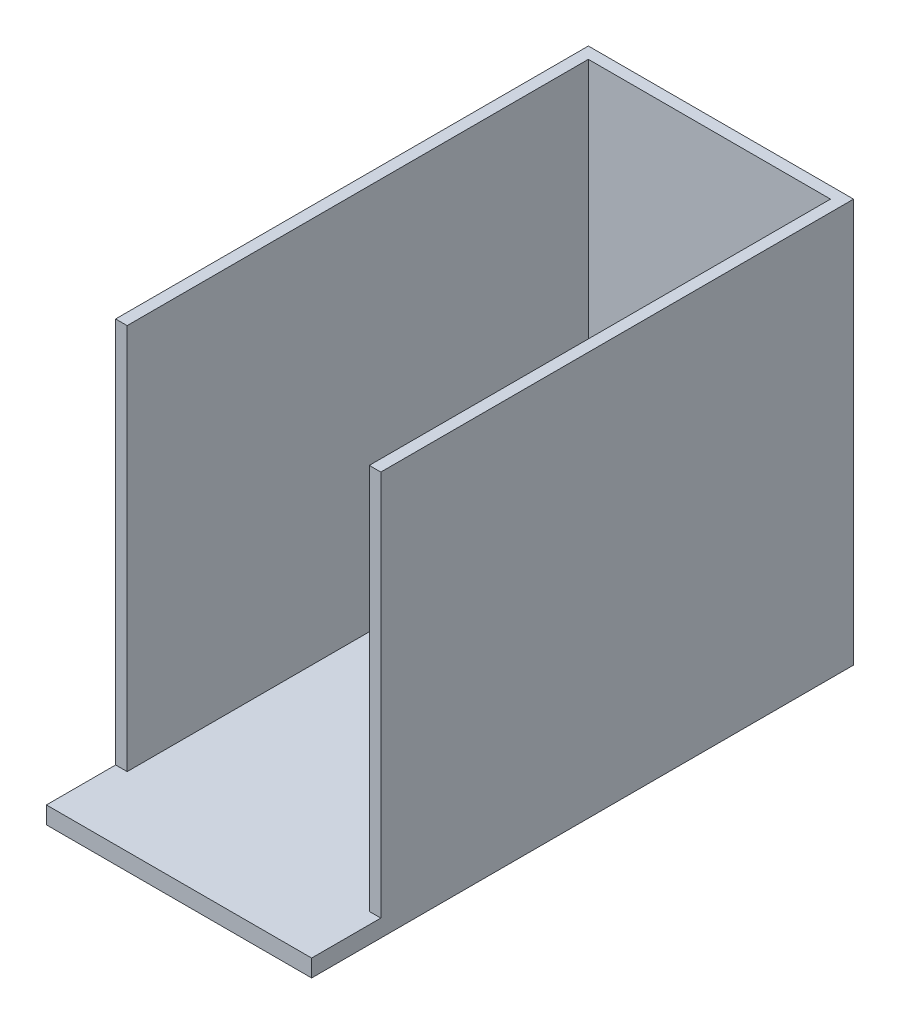
ISO-10303-21;
HEADER;
FILE_DESCRIPTION(('STEP AP214'),'2;1');
FILE_NAME('part.step','',(''),(''),'','','');
FILE_SCHEMA(('AUTOMOTIVE_DESIGN { 1 0 10303 214 1 1 1 1 }'));
ENDSEC;
DATA;
#1=APPLICATION_CONTEXT('core data for automotive mechanical design processes');
#2=APPLICATION_PROTOCOL_DEFINITION('international standard','automotive_design',2000,#1);
#3=PRODUCT_CONTEXT('',#1,'mechanical');
#4=PRODUCT('Part','Part','',(#3));
#5=PRODUCT_RELATED_PRODUCT_CATEGORY('part','',(#4));
#6=PRODUCT_DEFINITION_FORMATION('','',#4);
#7=PRODUCT_DEFINITION_CONTEXT('part definition',#1,'design');
#8=PRODUCT_DEFINITION('design','',#6,#7);
#9=PRODUCT_DEFINITION_SHAPE('','',#8);
#10=(LENGTH_UNIT() NAMED_UNIT(*) SI_UNIT(.MILLI.,.METRE.));
#11=(NAMED_UNIT(*) PLANE_ANGLE_UNIT() SI_UNIT($,.RADIAN.));
#12=(NAMED_UNIT(*) SI_UNIT($,.STERADIAN.) SOLID_ANGLE_UNIT());
#13=UNCERTAINTY_MEASURE_WITH_UNIT(LENGTH_MEASURE(1.E-05),#10,'distance_accuracy_value','');
#14=(GEOMETRIC_REPRESENTATION_CONTEXT(3) GLOBAL_UNCERTAINTY_ASSIGNED_CONTEXT((#13)) GLOBAL_UNIT_ASSIGNED_CONTEXT((#10,
#11,#12)) REPRESENTATION_CONTEXT('',''));
#15=CARTESIAN_POINT('',(0.,0.,0.));
#16=DIRECTION('',(0.,0.,1.));
#17=DIRECTION('',(1.,0.,0.));
#18=AXIS2_PLACEMENT_3D('',#15,#16,#17);
#19=CARTESIAN_POINT('',(0.,19.05,0.));
#20=DIRECTION('',(0.,-1.,0.));
#21=DIRECTION('',(0.,0.,-1.));
#22=AXIS2_PLACEMENT_3D('',#19,#20,#21);
#23=PLANE('',#22);
#24=DIRECTION('',(1.,0.,0.));
#25=VECTOR('',#24,1.);
#26=CARTESIAN_POINT('',(-133.35,19.05,222.25));
#27=LINE('',#26,#25);
#28=CARTESIAN_POINT('',(-146.05,19.05,222.25));
#29=VERTEX_POINT('',#28);
#30=CARTESIAN_POINT('',(-133.35,19.05,222.25));
#31=VERTEX_POINT('',#30);
#32=EDGE_CURVE('E132',#29,#31,#27,.T.);
#33=ORIENTED_EDGE('',*,*,#32,.F.);
#34=DIRECTION('',(0.,0.,1.));
#35=VECTOR('',#34,1.);
#36=CARTESIAN_POINT('',(-146.05,19.05,298.45));
#37=LINE('',#36,#35);
#38=CARTESIAN_POINT('',(-146.05,19.05,298.45));
#39=VERTEX_POINT('',#38);
#40=EDGE_CURVE('E144',#29,#39,#37,.T.);
#41=ORIENTED_EDGE('',*,*,#40,.T.);
#42=DIRECTION('',(1.,0.,0.));
#43=VECTOR('',#42,1.);
#44=CARTESIAN_POINT('',(-146.05,19.05,298.45));
#45=LINE('',#44,#43);
#46=CARTESIAN_POINT('',(146.05,19.05,298.45));
#47=VERTEX_POINT('',#46);
#48=EDGE_CURVE('E147',#39,#47,#45,.T.);
#49=ORIENTED_EDGE('',*,*,#48,.T.);
#50=DIRECTION('',(0.,0.,-1.));
#51=VECTOR('',#50,1.);
#52=CARTESIAN_POINT('',(146.05,19.05,298.45));
#53=LINE('',#52,#51);
#54=CARTESIAN_POINT('',(146.05,19.05,222.25));
#55=VERTEX_POINT('',#54);
#56=EDGE_CURVE('E142',#47,#55,#53,.T.);
#57=ORIENTED_EDGE('',*,*,#56,.T.);
#58=DIRECTION('',(1.,0.,0.));
#59=VECTOR('',#58,1.);
#60=CARTESIAN_POINT('',(146.05,19.05,222.25));
#61=LINE('',#60,#59);
#62=CARTESIAN_POINT('',(133.35,19.05,222.25));
#63=VERTEX_POINT('',#62);
#64=EDGE_CURVE('E48',#63,#55,#61,.T.);
#65=ORIENTED_EDGE('',*,*,#64,.F.);
#66=DIRECTION('',(0.,0.,1.));
#67=VECTOR('',#66,1.);
#68=CARTESIAN_POINT('',(133.35,19.05,222.25));
#69=LINE('',#68,#67);
#70=CARTESIAN_POINT('',(133.35,19.05,-285.75));
#71=VERTEX_POINT('',#70);
#72=EDGE_CURVE('E52',#71,#63,#69,.T.);
#73=ORIENTED_EDGE('',*,*,#72,.F.);
#74=DIRECTION('',(1.,0.,0.));
#75=VECTOR('',#74,1.);
#76=CARTESIAN_POINT('',(133.35,19.05,-285.75));
#77=LINE('',#76,#75);
#78=CARTESIAN_POINT('',(-133.35,19.05,-285.75));
#79=VERTEX_POINT('',#78);
#80=EDGE_CURVE('E186',#79,#71,#77,.T.);
#81=ORIENTED_EDGE('',*,*,#80,.F.);
#82=DIRECTION('',(0.,0.,-1.));
#83=VECTOR('',#82,1.);
#84=CARTESIAN_POINT('',(-133.35,19.05,-285.75));
#85=LINE('',#84,#83);
#86=EDGE_CURVE('E201',#31,#79,#85,.T.);
#87=ORIENTED_EDGE('',*,*,#86,.F.);
#88=EDGE_LOOP('',(#33,#41,#49,#57,#65,#73,#81,#87));
#89=FACE_BOUND('',#88,.T.);
#90=ADVANCED_FACE('F33',(#89),#23,.F.);
#91=CARTESIAN_POINT('',(146.05,19.05,298.45));
#92=DIRECTION('',(-1.,0.,0.));
#93=DIRECTION('',(0.,0.,1.));
#94=AXIS2_PLACEMENT_3D('',#91,#92,#93);
#95=PLANE('',#94);
#96=DIRECTION('',(0.,0.,-1.));
#97=VECTOR('',#96,1.);
#98=CARTESIAN_POINT('',(146.05,0.,298.45));
#99=LINE('',#98,#97);
#100=CARTESIAN_POINT('',(146.05,0.,298.45));
#101=VERTEX_POINT('',#100);
#102=CARTESIAN_POINT('',(146.05,0.,-298.45));
#103=VERTEX_POINT('',#102);
#104=EDGE_CURVE('E133',#101,#103,#99,.T.);
#105=ORIENTED_EDGE('',*,*,#104,.T.);
#106=DIRECTION('',(0.,-1.,0.));
#107=VECTOR('',#106,1.);
#108=CARTESIAN_POINT('',(146.05,19.05,-298.45));
#109=LINE('',#108,#107);
#110=CARTESIAN_POINT('',(146.05,444.5,-298.45));
#111=VERTEX_POINT('',#110);
#112=EDGE_CURVE('E11',#111,#103,#109,.T.);
#113=ORIENTED_EDGE('',*,*,#112,.F.);
#114=DIRECTION('',(0.,0.,-1.));
#115=VECTOR('',#114,1.);
#116=CARTESIAN_POINT('',(146.05,444.5,-298.45));
#117=LINE('',#116,#115);
#118=CARTESIAN_POINT('',(146.05,444.5,222.25));
#119=VERTEX_POINT('',#118);
#120=EDGE_CURVE('E208',#119,#111,#117,.T.);
#121=ORIENTED_EDGE('',*,*,#120,.F.);
#122=DIRECTION('',(0.,-1.,0.));
#123=VECTOR('',#122,1.);
#124=CARTESIAN_POINT('',(146.05,444.5,222.25));
#125=LINE('',#124,#123);
#126=EDGE_CURVE('E178',#119,#55,#125,.T.);
#127=ORIENTED_EDGE('',*,*,#126,.T.);
#128=ORIENTED_EDGE('',*,*,#56,.F.);
#129=DIRECTION('',(0.,-1.,0.));
#130=VECTOR('',#129,1.);
#131=CARTESIAN_POINT('',(146.05,19.05,298.45));
#132=LINE('',#131,#130);
#133=EDGE_CURVE('E148',#47,#101,#132,.T.);
#134=ORIENTED_EDGE('',*,*,#133,.T.);
#135=EDGE_LOOP('',(#105,#113,#121,#127,#128,#134));
#136=FACE_BOUND('',#135,.T.);
#137=ADVANCED_FACE('F35',(#136),#95,.F.);
#138=CARTESIAN_POINT('',(-146.05,19.05,-298.45));
#139=DIRECTION('',(0.,0.,1.));
#140=DIRECTION('',(1.,0.,0.));
#141=AXIS2_PLACEMENT_3D('',#138,#139,#140);
#142=PLANE('',#141);
#143=DIRECTION('',(-1.,0.,0.));
#144=VECTOR('',#143,1.);
#145=CARTESIAN_POINT('',(-146.05,0.,-298.45));
#146=LINE('',#145,#144);
#147=CARTESIAN_POINT('',(-146.05,0.,-298.45));
#148=VERTEX_POINT('',#147);
#149=EDGE_CURVE('E136',#103,#148,#146,.T.);
#150=ORIENTED_EDGE('',*,*,#149,.T.);
#151=DIRECTION('',(0.,-1.,0.));
#152=VECTOR('',#151,1.);
#153=CARTESIAN_POINT('',(-146.05,19.05,-298.45));
#154=LINE('',#153,#152);
#155=CARTESIAN_POINT('',(-146.05,444.5,-298.45));
#156=VERTEX_POINT('',#155);
#157=EDGE_CURVE('E41',#156,#148,#154,.T.);
#158=ORIENTED_EDGE('',*,*,#157,.F.);
#159=DIRECTION('',(-1.,0.,0.));
#160=VECTOR('',#159,1.);
#161=CARTESIAN_POINT('',(-146.05,444.5,-298.45));
#162=LINE('',#161,#160);
#163=EDGE_CURVE('E206',#111,#156,#162,.T.);
#164=ORIENTED_EDGE('',*,*,#163,.F.);
#165=ORIENTED_EDGE('',*,*,#112,.T.);
#166=EDGE_LOOP('',(#150,#158,#164,#165));
#167=FACE_BOUND('',#166,.T.);
#168=ADVANCED_FACE('F214',(#167),#142,.F.);
#169=CARTESIAN_POINT('',(-146.05,19.05,298.45));
#170=DIRECTION('',(1.,0.,0.));
#171=DIRECTION('',(0.,0.,-1.));
#172=AXIS2_PLACEMENT_3D('',#169,#170,#171);
#173=PLANE('',#172);
#174=DIRECTION('',(0.,0.,1.));
#175=VECTOR('',#174,1.);
#176=CARTESIAN_POINT('',(-146.05,0.,298.45));
#177=LINE('',#176,#175);
#178=CARTESIAN_POINT('',(-146.05,0.,298.45));
#179=VERTEX_POINT('',#178);
#180=EDGE_CURVE('E151',#148,#179,#177,.T.);
#181=ORIENTED_EDGE('',*,*,#180,.T.);
#182=DIRECTION('',(0.,-1.,0.));
#183=VECTOR('',#182,1.);
#184=CARTESIAN_POINT('',(-146.05,19.05,298.45));
#185=LINE('',#184,#183);
#186=EDGE_CURVE('E156',#39,#179,#185,.T.);
#187=ORIENTED_EDGE('',*,*,#186,.F.);
#188=ORIENTED_EDGE('',*,*,#40,.F.);
#189=DIRECTION('',(0.,-1.,0.));
#190=VECTOR('',#189,1.);
#191=CARTESIAN_POINT('',(-146.05,444.5,222.25));
#192=LINE('',#191,#190);
#193=CARTESIAN_POINT('',(-146.05,444.5,222.25));
#194=VERTEX_POINT('',#193);
#195=EDGE_CURVE('E190',#194,#29,#192,.T.);
#196=ORIENTED_EDGE('',*,*,#195,.F.);
#197=DIRECTION('',(0.,0.,1.));
#198=VECTOR('',#197,1.);
#199=CARTESIAN_POINT('',(-146.05,444.5,222.25));
#200=LINE('',#199,#198);
#201=EDGE_CURVE('E126',#156,#194,#200,.T.);
#202=ORIENTED_EDGE('',*,*,#201,.F.);
#203=ORIENTED_EDGE('',*,*,#157,.T.);
#204=EDGE_LOOP('',(#181,#187,#188,#196,#202,#203));
#205=FACE_BOUND('',#204,.T.);
#206=ADVANCED_FACE('F161',(#205),#173,.F.);
#207=CARTESIAN_POINT('',(-146.05,19.05,298.45));
#208=DIRECTION('',(0.,0.,-1.));
#209=DIRECTION('',(-1.,0.,0.));
#210=AXIS2_PLACEMENT_3D('',#207,#208,#209);
#211=PLANE('',#210);
#212=DIRECTION('',(1.,0.,0.));
#213=VECTOR('',#212,1.);
#214=CARTESIAN_POINT('',(-146.05,0.,298.45));
#215=LINE('',#214,#213);
#216=EDGE_CURVE('E145',#179,#101,#215,.T.);
#217=ORIENTED_EDGE('',*,*,#216,.T.);
#218=ORIENTED_EDGE('',*,*,#133,.F.);
#219=ORIENTED_EDGE('',*,*,#48,.F.);
#220=ORIENTED_EDGE('',*,*,#186,.T.);
#221=EDGE_LOOP('',(#217,#218,#219,#220));
#222=FACE_BOUND('',#221,.T.);
#223=ADVANCED_FACE('F171',(#222),#211,.F.);
#224=CARTESIAN_POINT('',(0.,0.,0.));
#225=DIRECTION('',(0.,-1.,0.));
#226=DIRECTION('',(0.,0.,-1.));
#227=AXIS2_PLACEMENT_3D('',#224,#225,#226);
#228=PLANE('',#227);
#229=ORIENTED_EDGE('',*,*,#104,.F.);
#230=ORIENTED_EDGE('',*,*,#216,.F.);
#231=ORIENTED_EDGE('',*,*,#180,.F.);
#232=ORIENTED_EDGE('',*,*,#149,.F.);
#233=EDGE_LOOP('',(#229,#230,#231,#232));
#234=FACE_BOUND('',#233,.T.);
#235=ADVANCED_FACE('F168',(#234),#228,.T.);
#236=CARTESIAN_POINT('',(-133.35,444.5,222.25));
#237=DIRECTION('',(0.,0.,-1.));
#238=DIRECTION('',(-1.,0.,0.));
#239=AXIS2_PLACEMENT_3D('',#236,#237,#238);
#240=PLANE('',#239);
#241=ORIENTED_EDGE('',*,*,#32,.T.);
#242=DIRECTION('',(0.,-1.,0.));
#243=VECTOR('',#242,1.);
#244=CARTESIAN_POINT('',(-133.35,444.5,222.25));
#245=LINE('',#244,#243);
#246=CARTESIAN_POINT('',(-133.35,444.5,222.25));
#247=VERTEX_POINT('',#246);
#248=EDGE_CURVE('E113',#247,#31,#245,.T.);
#249=ORIENTED_EDGE('',*,*,#248,.F.);
#250=DIRECTION('',(1.,0.,0.));
#251=VECTOR('',#250,1.);
#252=CARTESIAN_POINT('',(-133.35,444.5,222.25));
#253=LINE('',#252,#251);
#254=EDGE_CURVE('E120',#194,#247,#253,.T.);
#255=ORIENTED_EDGE('',*,*,#254,.F.);
#256=ORIENTED_EDGE('',*,*,#195,.T.);
#257=EDGE_LOOP('',(#241,#249,#255,#256));
#258=FACE_BOUND('',#257,.T.);
#259=ADVANCED_FACE('F131',(#258),#240,.F.);
#260=CARTESIAN_POINT('',(-133.35,444.5,-285.75));
#261=DIRECTION('',(-1.,0.,0.));
#262=DIRECTION('',(0.,0.,1.));
#263=AXIS2_PLACEMENT_3D('',#260,#261,#262);
#264=PLANE('',#263);
#265=ORIENTED_EDGE('',*,*,#86,.T.);
#266=DIRECTION('',(0.,-1.,0.));
#267=VECTOR('',#266,1.);
#268=CARTESIAN_POINT('',(-133.35,444.5,-285.75));
#269=LINE('',#268,#267);
#270=CARTESIAN_POINT('',(-133.35,444.5,-285.75));
#271=VERTEX_POINT('',#270);
#272=EDGE_CURVE('E116',#271,#79,#269,.T.);
#273=ORIENTED_EDGE('',*,*,#272,.F.);
#274=DIRECTION('',(0.,0.,-1.));
#275=VECTOR('',#274,1.);
#276=CARTESIAN_POINT('',(-133.35,444.5,-285.75));
#277=LINE('',#276,#275);
#278=EDGE_CURVE('E108',#247,#271,#277,.T.);
#279=ORIENTED_EDGE('',*,*,#278,.F.);
#280=ORIENTED_EDGE('',*,*,#248,.T.);
#281=EDGE_LOOP('',(#265,#273,#279,#280));
#282=FACE_BOUND('',#281,.T.);
#283=ADVANCED_FACE('F111',(#282),#264,.F.);
#284=CARTESIAN_POINT('',(133.35,444.5,-285.75));
#285=DIRECTION('',(0.,0.,-1.));
#286=DIRECTION('',(-1.,0.,0.));
#287=AXIS2_PLACEMENT_3D('',#284,#285,#286);
#288=PLANE('',#287);
#289=ORIENTED_EDGE('',*,*,#80,.T.);
#290=DIRECTION('',(0.,-1.,0.));
#291=VECTOR('',#290,1.);
#292=CARTESIAN_POINT('',(133.35,444.5,-285.75));
#293=LINE('',#292,#291);
#294=CARTESIAN_POINT('',(133.35,444.5,-285.75));
#295=VERTEX_POINT('',#294);
#296=EDGE_CURVE('E138',#295,#71,#293,.T.);
#297=ORIENTED_EDGE('',*,*,#296,.F.);
#298=DIRECTION('',(1.,0.,0.));
#299=VECTOR('',#298,1.);
#300=CARTESIAN_POINT('',(133.35,444.5,-285.75));
#301=LINE('',#300,#299);
#302=EDGE_CURVE('E119',#271,#295,#301,.T.);
#303=ORIENTED_EDGE('',*,*,#302,.F.);
#304=ORIENTED_EDGE('',*,*,#272,.T.);
#305=EDGE_LOOP('',(#289,#297,#303,#304));
#306=FACE_BOUND('',#305,.T.);
#307=ADVANCED_FACE('F200',(#306),#288,.F.);
#308=CARTESIAN_POINT('',(133.35,444.5,222.25));
#309=DIRECTION('',(1.,0.,0.));
#310=DIRECTION('',(0.,0.,-1.));
#311=AXIS2_PLACEMENT_3D('',#308,#309,#310);
#312=PLANE('',#311);
#313=ORIENTED_EDGE('',*,*,#72,.T.);
#314=DIRECTION('',(0.,-1.,0.));
#315=VECTOR('',#314,1.);
#316=CARTESIAN_POINT('',(133.35,444.5,222.25));
#317=LINE('',#316,#315);
#318=CARTESIAN_POINT('',(133.35,444.5,222.25));
#319=VERTEX_POINT('',#318);
#320=EDGE_CURVE('E184',#319,#63,#317,.T.);
#321=ORIENTED_EDGE('',*,*,#320,.F.);
#322=DIRECTION('',(0.,0.,1.));
#323=VECTOR('',#322,1.);
#324=CARTESIAN_POINT('',(133.35,444.5,222.25));
#325=LINE('',#324,#323);
#326=EDGE_CURVE('E198',#295,#319,#325,.T.);
#327=ORIENTED_EDGE('',*,*,#326,.F.);
#328=ORIENTED_EDGE('',*,*,#296,.T.);
#329=EDGE_LOOP('',(#313,#321,#327,#328));
#330=FACE_BOUND('',#329,.T.);
#331=ADVANCED_FACE('F197',(#330),#312,.F.);
#332=CARTESIAN_POINT('',(146.05,444.5,222.25));
#333=DIRECTION('',(0.,0.,-1.));
#334=DIRECTION('',(-1.,0.,0.));
#335=AXIS2_PLACEMENT_3D('',#332,#333,#334);
#336=PLANE('',#335);
#337=ORIENTED_EDGE('',*,*,#64,.T.);
#338=ORIENTED_EDGE('',*,*,#126,.F.);
#339=DIRECTION('',(1.,0.,0.));
#340=VECTOR('',#339,1.);
#341=CARTESIAN_POINT('',(146.05,444.5,222.25));
#342=LINE('',#341,#340);
#343=EDGE_CURVE('E211',#319,#119,#342,.T.);
#344=ORIENTED_EDGE('',*,*,#343,.F.);
#345=ORIENTED_EDGE('',*,*,#320,.T.);
#346=EDGE_LOOP('',(#337,#338,#344,#345));
#347=FACE_BOUND('',#346,.T.);
#348=ADVANCED_FACE('F181',(#347),#336,.F.);
#349=CARTESIAN_POINT('',(0.,444.5,0.));
#350=DIRECTION('',(0.,-1.,0.));
#351=DIRECTION('',(0.,0.,-1.));
#352=AXIS2_PLACEMENT_3D('',#349,#350,#351);
#353=PLANE('',#352);
#354=ORIENTED_EDGE('',*,*,#254,.T.);
#355=ORIENTED_EDGE('',*,*,#278,.T.);
#356=ORIENTED_EDGE('',*,*,#302,.T.);
#357=ORIENTED_EDGE('',*,*,#326,.T.);
#358=ORIENTED_EDGE('',*,*,#343,.T.);
#359=ORIENTED_EDGE('',*,*,#120,.T.);
#360=ORIENTED_EDGE('',*,*,#163,.T.);
#361=ORIENTED_EDGE('',*,*,#201,.T.);
#362=EDGE_LOOP('',(#354,#355,#356,#357,#358,#359,#360,#361));
#363=FACE_BOUND('',#362,.T.);
#364=ADVANCED_FACE('F123',(#363),#353,.F.);
#365=CLOSED_SHELL('',(#90,#137,#168,#206,#223,#235,#259,#283,#307,#331,#348,#364));
#366=MANIFOLD_SOLID_BREP('B2',#365);
#367=ADVANCED_BREP_SHAPE_REPRESENTATION('',(#18,#366),#14);
#368=SHAPE_DEFINITION_REPRESENTATION(#9,#367);
ENDSEC;
END-ISO-10303-21;
